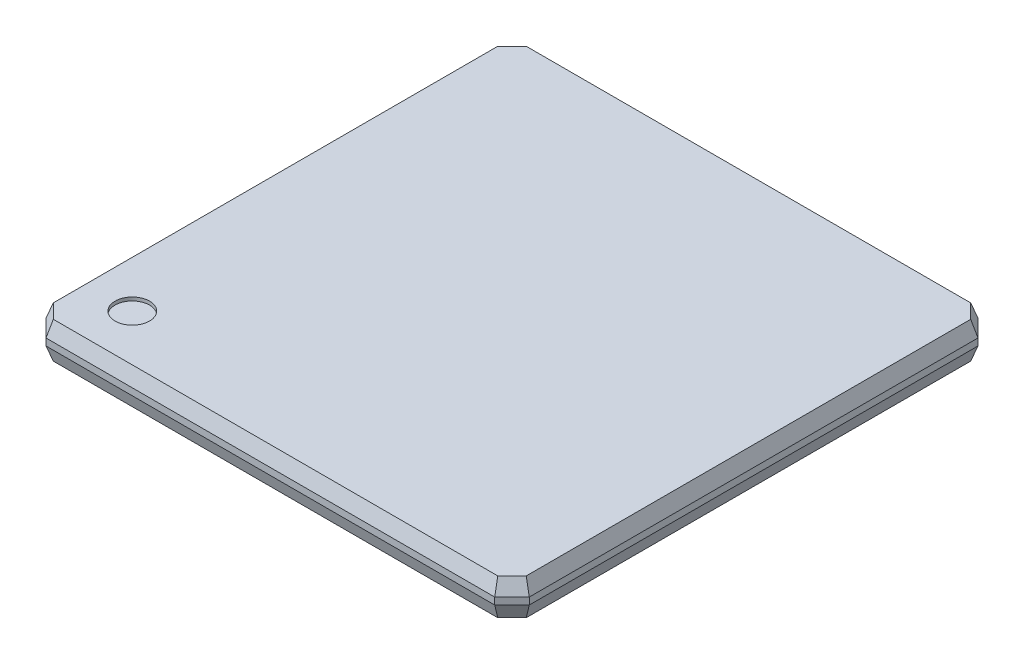
ISO-10303-21;
HEADER;
FILE_DESCRIPTION(('STEP AP214'),'2;1');
FILE_NAME('part.step','',(''),(''),'','','');
FILE_SCHEMA(('AUTOMOTIVE_DESIGN { 1 0 10303 214 1 1 1 1 }'));
ENDSEC;
DATA;
#1=APPLICATION_CONTEXT('core data for automotive mechanical design processes');
#2=APPLICATION_PROTOCOL_DEFINITION('international standard','automotive_design',2000,#1);
#3=PRODUCT_CONTEXT('',#1,'mechanical');
#4=PRODUCT('Part','Part','',(#3));
#5=PRODUCT_RELATED_PRODUCT_CATEGORY('part','',(#4));
#6=PRODUCT_DEFINITION_FORMATION('','',#4);
#7=PRODUCT_DEFINITION_CONTEXT('part definition',#1,'design');
#8=PRODUCT_DEFINITION('design','',#6,#7);
#9=PRODUCT_DEFINITION_SHAPE('','',#8);
#10=(LENGTH_UNIT() NAMED_UNIT(*) SI_UNIT(.MILLI.,.METRE.));
#11=(NAMED_UNIT(*) PLANE_ANGLE_UNIT() SI_UNIT($,.RADIAN.));
#12=(NAMED_UNIT(*) SI_UNIT($,.STERADIAN.) SOLID_ANGLE_UNIT());
#13=UNCERTAINTY_MEASURE_WITH_UNIT(LENGTH_MEASURE(1.E-05),#10,'distance_accuracy_value','');
#14=(GEOMETRIC_REPRESENTATION_CONTEXT(3) GLOBAL_UNCERTAINTY_ASSIGNED_CONTEXT((#13)) GLOBAL_UNIT_ASSIGNED_CONTEXT((#10,
#11,#12)) REPRESENTATION_CONTEXT('',''));
#15=CARTESIAN_POINT('',(0.,0.,0.));
#16=DIRECTION('',(0.,0.,1.));
#17=DIRECTION('',(1.,0.,0.));
#18=AXIS2_PLACEMENT_3D('',#15,#16,#17);
#19=CARTESIAN_POINT('',(-5.5,1.1,5.5));
#20=DIRECTION('',(0.,1.,0.));
#21=DIRECTION('',(0.,0.,1.));
#22=AXIS2_PLACEMENT_3D('',#19,#20,#21);
#23=PLANE('',#22);
#24=CARTESIAN_POINT('',(-5.5,1.1,5.5));
#25=DIRECTION('',(0.,-1.,0.));
#26=DIRECTION('',(0.,0.,-1.));
#27=AXIS2_PLACEMENT_3D('',#24,#25,#26);
#28=CIRCLE('',#27,0.5);
#29=CARTESIAN_POINT('',(-5.5,1.1,5.));
#30=VERTEX_POINT('',#29);
#31=EDGE_CURVE('E20',#30,#30,#28,.F.);
#32=ORIENTED_EDGE('',*,*,#31,.T.);
#33=EDGE_LOOP('',(#32));
#34=FACE_BOUND('',#33,.T.);
#35=ADVANCED_FACE('F17',(#34),#23,.T.);
#36=CARTESIAN_POINT('',(-5.5,1.2,5.5));
#37=DIRECTION('',(0.,-1.,0.));
#38=DIRECTION('',(0.,0.,-1.));
#39=AXIS2_PLACEMENT_3D('',#36,#37,#38);
#40=CYLINDRICAL_SURFACE('',#39,0.5);
#41=ORIENTED_EDGE('',*,*,#31,.F.);
#42=EDGE_LOOP('',(#41));
#43=FACE_BOUND('',#42,.T.);
#44=CARTESIAN_POINT('',(-5.5,1.2,5.5));
#45=DIRECTION('',(0.,-1.,0.));
#46=DIRECTION('',(0.,0.,-1.));
#47=AXIS2_PLACEMENT_3D('',#44,#45,#46);
#48=CIRCLE('',#47,0.5);
#49=CARTESIAN_POINT('',(-5.5,1.2,5.));
#50=VERTEX_POINT('',#49);
#51=EDGE_CURVE('E142',#50,#50,#48,.T.);
#52=ORIENTED_EDGE('',*,*,#51,.F.);
#53=EDGE_LOOP('',(#52));
#54=FACE_BOUND('',#53,.T.);
#55=ADVANCED_FACE('F165',(#43,#54),#40,.F.);
#56=CARTESIAN_POINT('',(0.,1.2,-7.));
#57=DIRECTION('',(0.,1.,0.));
#58=DIRECTION('',(0.,0.,1.));
#59=AXIS2_PLACEMENT_3D('',#56,#57,#58);
#60=PLANE('',#59);
#61=ORIENTED_EDGE('',*,*,#51,.T.);
#62=EDGE_LOOP('',(#61));
#63=FACE_BOUND('',#62,.T.);
#64=DIRECTION('',(-0.707106781186548,0.,0.707106781186548));
#65=VECTOR('',#64,1.);
#66=CARTESIAN_POINT('',(-4.89393398282204,1.20000000000002,-8.39393398282204));
#67=LINE('',#66,#65);
#68=CARTESIAN_POINT('',(-6.85000000000003,1.20000000000001,-6.43786796564401));
#69=VERTEX_POINT('',#68);
#70=CARTESIAN_POINT('',(-6.43786796564402,1.20000000000001,-6.85000000000003));
#71=VERTEX_POINT('',#70);
#72=EDGE_CURVE('E485',#69,#71,#67,.F.);
#73=ORIENTED_EDGE('',*,*,#72,.F.);
#74=DIRECTION('',(0.,0.,1.));
#75=VECTOR('',#74,1.);
#76=CARTESIAN_POINT('',(-6.85000000000004,1.20000000000001,-7.));
#77=LINE('',#76,#75);
#78=CARTESIAN_POINT('',(-6.85000000000003,1.20000000000001,6.43786796564402));
#79=VERTEX_POINT('',#78);
#80=EDGE_CURVE('E490',#79,#69,#77,.F.);
#81=ORIENTED_EDGE('',*,*,#80,.F.);
#82=DIRECTION('',(0.707106781186548,0.,0.707106781186548));
#83=VECTOR('',#82,1.);
#84=CARTESIAN_POINT('',(-8.39393398282204,1.20000000000002,4.89393398282204));
#85=LINE('',#84,#83);
#86=CARTESIAN_POINT('',(-6.43786796564401,1.20000000000001,6.85000000000003));
#87=VERTEX_POINT('',#86);
#88=EDGE_CURVE('E495',#87,#79,#85,.F.);
#89=ORIENTED_EDGE('',*,*,#88,.F.);
#90=DIRECTION('',(1.,0.,0.));
#91=VECTOR('',#90,1.);
#92=CARTESIAN_POINT('',(0.,1.20000000000001,6.85000000000004));
#93=LINE('',#92,#91);
#94=CARTESIAN_POINT('',(6.43786796564402,1.20000000000001,6.85000000000003));
#95=VERTEX_POINT('',#94);
#96=EDGE_CURVE('E449',#95,#87,#93,.F.);
#97=ORIENTED_EDGE('',*,*,#96,.F.);
#98=DIRECTION('',(0.707106781186548,0.,-0.707106781186548));
#99=VECTOR('',#98,1.);
#100=CARTESIAN_POINT('',(8.39393398282204,1.20000000000002,4.89393398282204));
#101=LINE('',#100,#99);
#102=CARTESIAN_POINT('',(6.85000000000003,1.20000000000001,6.43786796564401));
#103=VERTEX_POINT('',#102);
#104=EDGE_CURVE('E147',#103,#95,#101,.F.);
#105=ORIENTED_EDGE('',*,*,#104,.F.);
#106=DIRECTION('',(0.,0.,1.));
#107=VECTOR('',#106,1.);
#108=CARTESIAN_POINT('',(6.85000000000004,1.20000000000001,-7.));
#109=LINE('',#108,#107);
#110=CARTESIAN_POINT('',(6.85000000000003,1.20000000000001,-6.43786796564402));
#111=VERTEX_POINT('',#110);
#112=EDGE_CURVE('E128',#111,#103,#109,.T.);
#113=ORIENTED_EDGE('',*,*,#112,.F.);
#114=DIRECTION('',(-0.707106781186548,0.,-0.707106781186548));
#115=VECTOR('',#114,1.);
#116=CARTESIAN_POINT('',(4.89393398282204,1.20000000000002,-8.39393398282204));
#117=LINE('',#116,#115);
#118=CARTESIAN_POINT('',(6.43786796564402,1.20000000000001,-6.85000000000003));
#119=VERTEX_POINT('',#118);
#120=EDGE_CURVE('E133',#119,#111,#117,.F.);
#121=ORIENTED_EDGE('',*,*,#120,.F.);
#122=DIRECTION('',(1.,0.,0.));
#123=VECTOR('',#122,1.);
#124=CARTESIAN_POINT('',(0.,1.20000000000001,-6.85000000000004));
#125=LINE('',#124,#123);
#126=EDGE_CURVE('E479',#71,#119,#125,.T.);
#127=ORIENTED_EDGE('',*,*,#126,.F.);
#128=EDGE_LOOP('',(#73,#81,#89,#97,#105,#113,#121,#127));
#129=FACE_BOUND('',#128,.T.);
#130=ADVANCED_FACE('F145',(#63,#129),#60,.T.);
#131=CARTESIAN_POINT('',(4.946966991411,0.9875,-8.446966991411));
#132=DIRECTION('',(0.666794859469875,0.332820117734938,-0.666794859469875));
#133=DIRECTION('',(-0.707106781186548,0.,-0.707106781186548));
#134=AXIS2_PLACEMENT_3D('',#131,#132,#133);
#135=PLANE('',#134);
#136=DIRECTION('',(-0.329701872278663,0.934155304790039,0.136566987037767));
#137=VECTOR('',#136,1.);
#138=CARTESIAN_POINT('',(6.99999999999996,0.774999999999987,-6.5));
#139=LINE('',#138,#137);
#140=CARTESIAN_POINT('',(6.99999999999998,0.774999999999988,-6.49999999999998));
#141=VERTEX_POINT('',#140);
#142=EDGE_CURVE('E135',#141,#111,#139,.T.);
#143=ORIENTED_EDGE('',*,*,#142,.F.);
#144=DIRECTION('',(-0.707106781186548,0.,-0.707106781186548));
#145=VECTOR('',#144,1.);
#146=CARTESIAN_POINT('',(6.75,0.775,-6.75));
#147=LINE('',#146,#145);
#148=CARTESIAN_POINT('',(6.49999999999998,0.774999999999988,-6.99999999999998));
#149=VERTEX_POINT('',#148);
#150=EDGE_CURVE('E477',#149,#141,#147,.F.);
#151=ORIENTED_EDGE('',*,*,#150,.F.);
#152=DIRECTION('',(0.136566987037767,-0.934155304790039,-0.329701872278663));
#153=VECTOR('',#152,1.);
#154=CARTESIAN_POINT('',(6.437867965644,1.20000000000001,-6.85000000000004));
#155=LINE('',#154,#153);
#156=EDGE_CURVE('E138',#119,#149,#155,.T.);
#157=ORIENTED_EDGE('',*,*,#156,.F.);
#158=ORIENTED_EDGE('',*,*,#120,.T.);
#159=EDGE_LOOP('',(#143,#151,#157,#158));
#160=FACE_BOUND('',#159,.T.);
#161=ADVANCED_FACE('F134',(#160),#135,.T.);
#162=CARTESIAN_POINT('',(6.925,0.9875,-7.));
#163=DIRECTION('',(0.942990333582945,0.332820117734981,0.));
#164=DIRECTION('',(-0.332820117734981,0.942990333582945,0.));
#165=AXIS2_PLACEMENT_3D('',#162,#163,#164);
#166=PLANE('',#165);
#167=DIRECTION('',(-0.329701872278644,0.934155304790071,-0.136566987037592));
#168=VECTOR('',#167,1.);
#169=CARTESIAN_POINT('',(6.99999999999996,0.77499999999998,6.49999999999996));
#170=LINE('',#169,#168);
#171=CARTESIAN_POINT('',(6.99999999999997,0.774999999999989,6.49999999999999));
#172=VERTEX_POINT('',#171);
#173=EDGE_CURVE('E149',#172,#103,#170,.T.);
#174=ORIENTED_EDGE('',*,*,#173,.F.);
#175=DIRECTION('',(0.,0.,-1.));
#176=VECTOR('',#175,1.);
#177=CARTESIAN_POINT('',(7.,0.775,-7.));
#178=LINE('',#177,#176);
#179=EDGE_CURVE('E154',#141,#172,#178,.F.);
#180=ORIENTED_EDGE('',*,*,#179,.F.);
#181=ORIENTED_EDGE('',*,*,#142,.T.);
#182=ORIENTED_EDGE('',*,*,#112,.T.);
#183=EDGE_LOOP('',(#174,#180,#181,#182));
#184=FACE_BOUND('',#183,.T.);
#185=ADVANCED_FACE('F152',(#184),#166,.T.);
#186=CARTESIAN_POINT('',(8.446966991411,0.9875,4.946966991411));
#187=DIRECTION('',(0.666794859469875,0.332820117734938,0.666794859469875));
#188=DIRECTION('',(0.707106781186548,0.,-0.707106781186548));
#189=AXIS2_PLACEMENT_3D('',#186,#187,#188);
#190=PLANE('',#189);
#191=DIRECTION('',(-0.136566987037767,0.934155304790039,-0.329701872278663));
#192=VECTOR('',#191,1.);
#193=CARTESIAN_POINT('',(6.5,0.774999999999987,6.99999999999996));
#194=LINE('',#193,#192);
#195=CARTESIAN_POINT('',(6.49999999999998,0.774999999999988,6.99999999999998));
#196=VERTEX_POINT('',#195);
#197=EDGE_CURVE('E445',#196,#95,#194,.T.);
#198=ORIENTED_EDGE('',*,*,#197,.F.);
#199=DIRECTION('',(0.707106781186548,0.,-0.707106781186548));
#200=VECTOR('',#199,1.);
#201=CARTESIAN_POINT('',(6.75,0.775,6.75));
#202=LINE('',#201,#200);
#203=EDGE_CURVE('E447',#172,#196,#202,.F.);
#204=ORIENTED_EDGE('',*,*,#203,.F.);
#205=ORIENTED_EDGE('',*,*,#173,.T.);
#206=ORIENTED_EDGE('',*,*,#104,.T.);
#207=EDGE_LOOP('',(#198,#204,#205,#206));
#208=FACE_BOUND('',#207,.T.);
#209=ADVANCED_FACE('F264',(#208),#190,.T.);
#210=CARTESIAN_POINT('',(0.,0.9875,6.925));
#211=DIRECTION('',(0.,0.332820117734981,0.942990333582945));
#212=DIRECTION('',(0.,-0.942990333582945,0.332820117734981));
#213=AXIS2_PLACEMENT_3D('',#210,#211,#212);
#214=PLANE('',#213);
#215=ORIENTED_EDGE('',*,*,#197,.T.);
#216=ORIENTED_EDGE('',*,*,#96,.T.);
#217=DIRECTION('',(0.136566987037592,0.934155304790071,-0.329701872278644));
#218=VECTOR('',#217,1.);
#219=CARTESIAN_POINT('',(-6.49999999999996,0.77499999999998,6.99999999999996));
#220=LINE('',#219,#218);
#221=CARTESIAN_POINT('',(-6.49999999999999,0.774999999999989,6.99999999999997));
#222=VERTEX_POINT('',#221);
#223=EDGE_CURVE('E461',#222,#87,#220,.T.);
#224=ORIENTED_EDGE('',*,*,#223,.F.);
#225=DIRECTION('',(1.,0.,0.));
#226=VECTOR('',#225,1.);
#227=CARTESIAN_POINT('',(0.,0.775,7.));
#228=LINE('',#227,#226);
#229=EDGE_CURVE('E459',#196,#222,#228,.F.);
#230=ORIENTED_EDGE('',*,*,#229,.F.);
#231=EDGE_LOOP('',(#215,#216,#224,#230));
#232=FACE_BOUND('',#231,.T.);
#233=ADVANCED_FACE('F260',(#232),#214,.T.);
#234=CARTESIAN_POINT('',(-8.446966991411,0.9875,4.946966991411));
#235=DIRECTION('',(-0.666794859469875,0.332820117734938,0.666794859469875));
#236=DIRECTION('',(0.707106781186548,0.,0.707106781186548));
#237=AXIS2_PLACEMENT_3D('',#234,#235,#236);
#238=PLANE('',#237);
#239=DIRECTION('',(0.329701872278663,0.934155304790039,-0.136566987037767));
#240=VECTOR('',#239,1.);
#241=CARTESIAN_POINT('',(-6.99999999999996,0.774999999999987,6.5));
#242=LINE('',#241,#240);
#243=CARTESIAN_POINT('',(-6.99999999999998,0.774999999999988,6.49999999999998));
#244=VERTEX_POINT('',#243);
#245=EDGE_CURVE('E492',#244,#79,#242,.T.);
#246=ORIENTED_EDGE('',*,*,#245,.F.);
#247=DIRECTION('',(0.707106781186548,0.,0.707106781186548));
#248=VECTOR('',#247,1.);
#249=CARTESIAN_POINT('',(-6.75,0.775,6.75));
#250=LINE('',#249,#248);
#251=EDGE_CURVE('E464',#222,#244,#250,.F.);
#252=ORIENTED_EDGE('',*,*,#251,.F.);
#253=ORIENTED_EDGE('',*,*,#223,.T.);
#254=ORIENTED_EDGE('',*,*,#88,.T.);
#255=EDGE_LOOP('',(#246,#252,#253,#254));
#256=FACE_BOUND('',#255,.T.);
#257=ADVANCED_FACE('F256',(#256),#238,.T.);
#258=CARTESIAN_POINT('',(-6.925,0.9875,-7.));
#259=DIRECTION('',(-0.942990333582945,0.332820117734981,0.));
#260=DIRECTION('',(-0.332820117734981,-0.942990333582945,0.));
#261=AXIS2_PLACEMENT_3D('',#258,#259,#260);
#262=PLANE('',#261);
#263=ORIENTED_EDGE('',*,*,#245,.T.);
#264=ORIENTED_EDGE('',*,*,#80,.T.);
#265=DIRECTION('',(0.329701872278644,0.934155304790071,0.136566987037592));
#266=VECTOR('',#265,1.);
#267=CARTESIAN_POINT('',(-6.99999999999996,0.77499999999998,-6.49999999999996));
#268=LINE('',#267,#266);
#269=CARTESIAN_POINT('',(-6.99999999999997,0.774999999999989,-6.49999999999999));
#270=VERTEX_POINT('',#269);
#271=EDGE_CURVE('E487',#270,#69,#268,.T.);
#272=ORIENTED_EDGE('',*,*,#271,.F.);
#273=DIRECTION('',(0.,0.,1.));
#274=VECTOR('',#273,1.);
#275=CARTESIAN_POINT('',(-7.,0.775,-7.));
#276=LINE('',#275,#274);
#277=EDGE_CURVE('E509',#244,#270,#276,.F.);
#278=ORIENTED_EDGE('',*,*,#277,.F.);
#279=EDGE_LOOP('',(#263,#264,#272,#278));
#280=FACE_BOUND('',#279,.T.);
#281=ADVANCED_FACE('F252',(#280),#262,.T.);
#282=CARTESIAN_POINT('',(-4.946966991411,0.9875,-8.446966991411));
#283=DIRECTION('',(-0.666794859469875,0.332820117734938,-0.666794859469875));
#284=DIRECTION('',(-0.707106781186548,0.,0.707106781186548));
#285=AXIS2_PLACEMENT_3D('',#282,#283,#284);
#286=PLANE('',#285);
#287=DIRECTION('',(0.136566987037767,0.934155304790039,0.329701872278663));
#288=VECTOR('',#287,1.);
#289=CARTESIAN_POINT('',(-6.5,0.774999999999987,-6.99999999999996));
#290=LINE('',#289,#288);
#291=CARTESIAN_POINT('',(-6.49999999999998,0.774999999999988,-6.99999999999998));
#292=VERTEX_POINT('',#291);
#293=EDGE_CURVE('E481',#292,#71,#290,.T.);
#294=ORIENTED_EDGE('',*,*,#293,.F.);
#295=DIRECTION('',(-0.707106781186548,0.,0.707106781186548));
#296=VECTOR('',#295,1.);
#297=CARTESIAN_POINT('',(-6.75,0.775,-6.75));
#298=LINE('',#297,#296);
#299=EDGE_CURVE('E512',#270,#292,#298,.F.);
#300=ORIENTED_EDGE('',*,*,#299,.F.);
#301=ORIENTED_EDGE('',*,*,#271,.T.);
#302=ORIENTED_EDGE('',*,*,#72,.T.);
#303=EDGE_LOOP('',(#294,#300,#301,#302));
#304=FACE_BOUND('',#303,.T.);
#305=ADVANCED_FACE('F248',(#304),#286,.T.);
#306=CARTESIAN_POINT('',(0.,0.9875,-6.925));
#307=DIRECTION('',(0.,0.332820117734981,-0.942990333582945));
#308=DIRECTION('',(0.,0.942990333582945,0.332820117734981));
#309=AXIS2_PLACEMENT_3D('',#306,#307,#308);
#310=PLANE('',#309);
#311=ORIENTED_EDGE('',*,*,#293,.T.);
#312=ORIENTED_EDGE('',*,*,#126,.T.);
#313=ORIENTED_EDGE('',*,*,#156,.T.);
#314=DIRECTION('',(1.,0.,0.));
#315=VECTOR('',#314,1.);
#316=CARTESIAN_POINT('',(0.,0.775,-7.));
#317=LINE('',#316,#315);
#318=EDGE_CURVE('E523',#149,#292,#317,.F.);
#319=ORIENTED_EDGE('',*,*,#318,.T.);
#320=EDGE_LOOP('',(#311,#312,#313,#319));
#321=FACE_BOUND('',#320,.T.);
#322=ADVANCED_FACE('F244',(#321),#310,.T.);
#323=CARTESIAN_POINT('',(6.75,0.675,-6.75));
#324=DIRECTION('',(0.707106781186548,0.,-0.707106781186548));
#325=DIRECTION('',(-0.707106781186548,0.,-0.707106781186548));
#326=AXIS2_PLACEMENT_3D('',#323,#324,#325);
#327=PLANE('',#326);
#328=DIRECTION('',(-0.707106781186548,0.,-0.707106781186548));
#329=VECTOR('',#328,1.);
#330=CARTESIAN_POINT('',(4.99999999999996,0.57500000000002,-8.49999999999996));
#331=LINE('',#330,#329);
#332=CARTESIAN_POINT('',(6.49999999999999,0.575000000000007,-6.99999999999999));
#333=VERTEX_POINT('',#332);
#334=CARTESIAN_POINT('',(6.99999999999999,0.575000000000007,-6.49999999999999));
#335=VERTEX_POINT('',#334);
#336=EDGE_CURVE('E526',#333,#335,#331,.F.);
#337=ORIENTED_EDGE('',*,*,#336,.F.);
#338=DIRECTION('',(0.,-1.,0.));
#339=VECTOR('',#338,1.);
#340=CARTESIAN_POINT('',(6.5,0.675,-7.));
#341=LINE('',#340,#339);
#342=EDGE_CURVE('E520',#333,#149,#341,.F.);
#343=ORIENTED_EDGE('',*,*,#342,.T.);
#344=ORIENTED_EDGE('',*,*,#150,.T.);
#345=DIRECTION('',(0.,1.,0.));
#346=VECTOR('',#345,1.);
#347=CARTESIAN_POINT('',(7.,0.675,-6.5));
#348=LINE('',#347,#346);
#349=EDGE_CURVE('E475',#335,#141,#348,.T.);
#350=ORIENTED_EDGE('',*,*,#349,.F.);
#351=EDGE_LOOP('',(#337,#343,#344,#350));
#352=FACE_BOUND('',#351,.T.);
#353=ADVANCED_FACE('F240',(#352),#327,.T.);
#354=CARTESIAN_POINT('',(7.,0.675,-7.));
#355=DIRECTION('',(1.,0.,0.));
#356=DIRECTION('',(0.,0.,-1.));
#357=AXIS2_PLACEMENT_3D('',#354,#355,#356);
#358=PLANE('',#357);
#359=DIRECTION('',(0.,1.,0.));
#360=VECTOR('',#359,1.);
#361=CARTESIAN_POINT('',(7.,0.675,6.5));
#362=LINE('',#361,#360);
#363=CARTESIAN_POINT('',(6.99999999999999,0.575000000000006,6.5));
#364=VERTEX_POINT('',#363);
#365=EDGE_CURVE('E456',#364,#172,#362,.T.);
#366=ORIENTED_EDGE('',*,*,#365,.F.);
#367=DIRECTION('',(0.,0.,1.));
#368=VECTOR('',#367,1.);
#369=CARTESIAN_POINT('',(6.99999999999996,0.575000000000013,-7.));
#370=LINE('',#369,#368);
#371=EDGE_CURVE('E532',#335,#364,#370,.T.);
#372=ORIENTED_EDGE('',*,*,#371,.F.);
#373=ORIENTED_EDGE('',*,*,#349,.T.);
#374=ORIENTED_EDGE('',*,*,#179,.T.);
#375=EDGE_LOOP('',(#366,#372,#373,#374));
#376=FACE_BOUND('',#375,.T.);
#377=ADVANCED_FACE('F236',(#376),#358,.T.);
#378=CARTESIAN_POINT('',(6.75,0.675,6.75));
#379=DIRECTION('',(0.707106781186548,0.,0.707106781186548));
#380=DIRECTION('',(0.707106781186548,0.,-0.707106781186548));
#381=AXIS2_PLACEMENT_3D('',#378,#379,#380);
#382=PLANE('',#381);
#383=DIRECTION('',(0.707106781186548,0.,-0.707106781186548));
#384=VECTOR('',#383,1.);
#385=CARTESIAN_POINT('',(8.49999999999996,0.57500000000002,4.99999999999996));
#386=LINE('',#385,#384);
#387=CARTESIAN_POINT('',(6.49999999999999,0.575000000000007,6.99999999999999));
#388=VERTEX_POINT('',#387);
#389=EDGE_CURVE('E538',#364,#388,#386,.F.);
#390=ORIENTED_EDGE('',*,*,#389,.F.);
#391=ORIENTED_EDGE('',*,*,#365,.T.);
#392=ORIENTED_EDGE('',*,*,#203,.T.);
#393=DIRECTION('',(0.,-1.,0.));
#394=VECTOR('',#393,1.);
#395=CARTESIAN_POINT('',(6.5,0.675,7.));
#396=LINE('',#395,#394);
#397=EDGE_CURVE('E454',#388,#196,#396,.F.);
#398=ORIENTED_EDGE('',*,*,#397,.F.);
#399=EDGE_LOOP('',(#390,#391,#392,#398));
#400=FACE_BOUND('',#399,.T.);
#401=ADVANCED_FACE('F232',(#400),#382,.T.);
#402=CARTESIAN_POINT('',(0.,0.675,7.));
#403=DIRECTION('',(0.,0.,1.));
#404=DIRECTION('',(0.,-1.,0.));
#405=AXIS2_PLACEMENT_3D('',#402,#403,#404);
#406=PLANE('',#405);
#407=ORIENTED_EDGE('',*,*,#397,.T.);
#408=ORIENTED_EDGE('',*,*,#229,.T.);
#409=DIRECTION('',(0.,1.,0.));
#410=VECTOR('',#409,1.);
#411=CARTESIAN_POINT('',(-6.5,0.675,7.));
#412=LINE('',#411,#410);
#413=CARTESIAN_POINT('',(-6.5,0.575000000000006,6.99999999999999));
#414=VERTEX_POINT('',#413);
#415=EDGE_CURVE('E503',#414,#222,#412,.T.);
#416=ORIENTED_EDGE('',*,*,#415,.F.);
#417=DIRECTION('',(1.,0.,0.));
#418=VECTOR('',#417,1.);
#419=CARTESIAN_POINT('',(0.,0.575000000000013,6.99999999999996));
#420=LINE('',#419,#418);
#421=EDGE_CURVE('E468',#388,#414,#420,.F.);
#422=ORIENTED_EDGE('',*,*,#421,.F.);
#423=EDGE_LOOP('',(#407,#408,#416,#422));
#424=FACE_BOUND('',#423,.T.);
#425=ADVANCED_FACE('F228',(#424),#406,.T.);
#426=CARTESIAN_POINT('',(-6.75,0.675,6.75));
#427=DIRECTION('',(-0.707106781186548,0.,0.707106781186548));
#428=DIRECTION('',(0.707106781186548,0.,0.707106781186548));
#429=AXIS2_PLACEMENT_3D('',#426,#427,#428);
#430=PLANE('',#429);
#431=DIRECTION('',(0.707106781186548,0.,0.707106781186548));
#432=VECTOR('',#431,1.);
#433=CARTESIAN_POINT('',(-8.49999999999996,0.57500000000002,4.99999999999996));
#434=LINE('',#433,#432);
#435=CARTESIAN_POINT('',(-6.99999999999999,0.575000000000007,6.49999999999999));
#436=VERTEX_POINT('',#435);
#437=EDGE_CURVE('E546',#414,#436,#434,.F.);
#438=ORIENTED_EDGE('',*,*,#437,.F.);
#439=ORIENTED_EDGE('',*,*,#415,.T.);
#440=ORIENTED_EDGE('',*,*,#251,.T.);
#441=DIRECTION('',(0.,1.,0.));
#442=VECTOR('',#441,1.);
#443=CARTESIAN_POINT('',(-7.,0.675,6.5));
#444=LINE('',#443,#442);
#445=EDGE_CURVE('E504',#436,#244,#444,.T.);
#446=ORIENTED_EDGE('',*,*,#445,.F.);
#447=EDGE_LOOP('',(#438,#439,#440,#446));
#448=FACE_BOUND('',#447,.T.);
#449=ADVANCED_FACE('F224',(#448),#430,.T.);
#450=CARTESIAN_POINT('',(-7.,0.675,-7.));
#451=DIRECTION('',(-1.,0.,0.));
#452=DIRECTION('',(0.,0.,1.));
#453=AXIS2_PLACEMENT_3D('',#450,#451,#452);
#454=PLANE('',#453);
#455=ORIENTED_EDGE('',*,*,#445,.T.);
#456=ORIENTED_EDGE('',*,*,#277,.T.);
#457=DIRECTION('',(0.,1.,0.));
#458=VECTOR('',#457,1.);
#459=CARTESIAN_POINT('',(-7.,0.675,-6.5));
#460=LINE('',#459,#458);
#461=CARTESIAN_POINT('',(-6.99999999999999,0.575000000000006,-6.5));
#462=VERTEX_POINT('',#461);
#463=EDGE_CURVE('E515',#462,#270,#460,.T.);
#464=ORIENTED_EDGE('',*,*,#463,.F.);
#465=DIRECTION('',(0.,0.,1.));
#466=VECTOR('',#465,1.);
#467=CARTESIAN_POINT('',(-6.99999999999996,0.575000000000013,-7.));
#468=LINE('',#467,#466);
#469=EDGE_CURVE('E552',#436,#462,#468,.F.);
#470=ORIENTED_EDGE('',*,*,#469,.F.);
#471=EDGE_LOOP('',(#455,#456,#464,#470));
#472=FACE_BOUND('',#471,.T.);
#473=ADVANCED_FACE('F220',(#472),#454,.T.);
#474=CARTESIAN_POINT('',(-6.75,0.675,-6.75));
#475=DIRECTION('',(-0.707106781186548,0.,-0.707106781186548));
#476=DIRECTION('',(-0.707106781186548,0.,0.707106781186548));
#477=AXIS2_PLACEMENT_3D('',#474,#475,#476);
#478=PLANE('',#477);
#479=DIRECTION('',(-0.707106781186548,0.,0.707106781186548));
#480=VECTOR('',#479,1.);
#481=CARTESIAN_POINT('',(-4.99999999999996,0.57500000000002,-8.49999999999996));
#482=LINE('',#481,#480);
#483=CARTESIAN_POINT('',(-6.49999999999999,0.575000000000007,-6.99999999999999));
#484=VERTEX_POINT('',#483);
#485=EDGE_CURVE('E558',#462,#484,#482,.F.);
#486=ORIENTED_EDGE('',*,*,#485,.F.);
#487=ORIENTED_EDGE('',*,*,#463,.T.);
#488=ORIENTED_EDGE('',*,*,#299,.T.);
#489=DIRECTION('',(0.,-1.,0.));
#490=VECTOR('',#489,1.);
#491=CARTESIAN_POINT('',(-6.5,0.675,-7.));
#492=LINE('',#491,#490);
#493=EDGE_CURVE('E518',#292,#484,#492,.T.);
#494=ORIENTED_EDGE('',*,*,#493,.T.);
#495=EDGE_LOOP('',(#486,#487,#488,#494));
#496=FACE_BOUND('',#495,.T.);
#497=ADVANCED_FACE('F216',(#496),#478,.T.);
#498=CARTESIAN_POINT('',(0.,0.675,-7.));
#499=DIRECTION('',(0.,0.,1.));
#500=DIRECTION('',(0.,-1.,0.));
#501=AXIS2_PLACEMENT_3D('',#498,#499,#500);
#502=PLANE('',#501);
#503=ORIENTED_EDGE('',*,*,#342,.F.);
#504=DIRECTION('',(1.,0.,0.));
#505=VECTOR('',#504,1.);
#506=CARTESIAN_POINT('',(0.,0.575000000000013,-6.99999999999996));
#507=LINE('',#506,#505);
#508=EDGE_CURVE('E564',#484,#333,#507,.T.);
#509=ORIENTED_EDGE('',*,*,#508,.F.);
#510=ORIENTED_EDGE('',*,*,#493,.F.);
#511=ORIENTED_EDGE('',*,*,#318,.F.);
#512=EDGE_LOOP('',(#503,#509,#510,#511));
#513=FACE_BOUND('',#512,.T.);
#514=ADVANCED_FACE('F212',(#513),#502,.F.);
#515=CARTESIAN_POINT('',(4.946966991411,0.3625,-8.446966991411));
#516=DIRECTION('',(0.666794859469875,-0.332820117734938,-0.666794859469875));
#517=DIRECTION('',(-0.707106781186548,0.,-0.707106781186548));
#518=AXIS2_PLACEMENT_3D('',#515,#516,#517);
#519=PLANE('',#518);
#520=DIRECTION('',(-0.136566987037767,-0.934155304790039,0.329701872278663));
#521=VECTOR('',#520,1.);
#522=CARTESIAN_POINT('',(6.5,0.575000000000013,-6.99999999999996));
#523=LINE('',#522,#521);
#524=CARTESIAN_POINT('',(6.43786796564402,0.149999999999988,-6.85000000000003));
#525=VERTEX_POINT('',#524);
#526=EDGE_CURVE('E560',#333,#525,#523,.T.);
#527=ORIENTED_EDGE('',*,*,#526,.F.);
#528=ORIENTED_EDGE('',*,*,#336,.T.);
#529=DIRECTION('',(0.329701872278663,0.934155304790039,-0.136566987037767));
#530=VECTOR('',#529,1.);
#531=CARTESIAN_POINT('',(6.85000000000004,0.149999999999988,-6.437867965644));
#532=LINE('',#531,#530);
#533=CARTESIAN_POINT('',(6.85000000000003,0.149999999999988,-6.43786796564402));
#534=VERTEX_POINT('',#533);
#535=EDGE_CURVE('E529',#534,#335,#532,.T.);
#536=ORIENTED_EDGE('',*,*,#535,.F.);
#537=DIRECTION('',(0.707106781186548,0.,0.707106781186548));
#538=VECTOR('',#537,1.);
#539=CARTESIAN_POINT('',(6.437867965644,0.150000000000001,-6.85));
#540=LINE('',#539,#538);
#541=EDGE_CURVE('E567',#525,#534,#540,.T.);
#542=ORIENTED_EDGE('',*,*,#541,.F.);
#543=EDGE_LOOP('',(#527,#528,#536,#542));
#544=FACE_BOUND('',#543,.T.);
#545=ADVANCED_FACE('F208',(#544),#519,.T.);
#546=CARTESIAN_POINT('',(6.925,0.3625,-7.));
#547=DIRECTION('',(0.942990333582945,-0.332820117734981,0.));
#548=DIRECTION('',(0.332820117734981,0.942990333582945,0.));
#549=AXIS2_PLACEMENT_3D('',#546,#547,#548);
#550=PLANE('',#549);
#551=DIRECTION('',(0.329701872278644,0.934155304790071,0.136566987037592));
#552=VECTOR('',#551,1.);
#553=CARTESIAN_POINT('',(6.85000000000004,0.149999999999981,6.43786796564404));
#554=LINE('',#553,#552);
#555=CARTESIAN_POINT('',(6.85000000000003,0.149999999999989,6.43786796564401));
#556=VERTEX_POINT('',#555);
#557=EDGE_CURVE('E535',#556,#364,#554,.T.);
#558=ORIENTED_EDGE('',*,*,#557,.F.);
#559=DIRECTION('',(0.,0.,1.));
#560=VECTOR('',#559,1.);
#561=CARTESIAN_POINT('',(6.85,0.150000000000001,-7.));
#562=LINE('',#561,#560);
#563=EDGE_CURVE('E570',#534,#556,#562,.T.);
#564=ORIENTED_EDGE('',*,*,#563,.F.);
#565=ORIENTED_EDGE('',*,*,#535,.T.);
#566=ORIENTED_EDGE('',*,*,#371,.T.);
#567=EDGE_LOOP('',(#558,#564,#565,#566));
#568=FACE_BOUND('',#567,.T.);
#569=ADVANCED_FACE('F204',(#568),#550,.T.);
#570=CARTESIAN_POINT('',(8.446966991411,0.3625,4.946966991411));
#571=DIRECTION('',(0.666794859469875,-0.332820117734938,0.666794859469875));
#572=DIRECTION('',(0.707106781186548,0.,-0.707106781186548));
#573=AXIS2_PLACEMENT_3D('',#570,#571,#572);
#574=PLANE('',#573);
#575=ORIENTED_EDGE('',*,*,#557,.T.);
#576=ORIENTED_EDGE('',*,*,#389,.T.);
#577=DIRECTION('',(0.136566987037767,0.934155304790039,0.329701872278663));
#578=VECTOR('',#577,1.);
#579=CARTESIAN_POINT('',(6.437867965644,0.149999999999988,6.85000000000004));
#580=LINE('',#579,#578);
#581=CARTESIAN_POINT('',(6.43786796564402,0.149999999999988,6.85000000000003));
#582=VERTEX_POINT('',#581);
#583=EDGE_CURVE('E540',#582,#388,#580,.T.);
#584=ORIENTED_EDGE('',*,*,#583,.F.);
#585=DIRECTION('',(-0.707106781186548,0.,0.707106781186548));
#586=VECTOR('',#585,1.);
#587=CARTESIAN_POINT('',(6.85,0.150000000000001,6.437867965644));
#588=LINE('',#587,#586);
#589=EDGE_CURVE('E573',#556,#582,#588,.T.);
#590=ORIENTED_EDGE('',*,*,#589,.F.);
#591=EDGE_LOOP('',(#575,#576,#584,#590));
#592=FACE_BOUND('',#591,.T.);
#593=ADVANCED_FACE('F200',(#592),#574,.T.);
#594=CARTESIAN_POINT('',(0.,0.3625,6.925));
#595=DIRECTION('',(0.,-0.332820117734981,0.942990333582945));
#596=DIRECTION('',(0.,-0.942990333582945,-0.332820117734981));
#597=AXIS2_PLACEMENT_3D('',#594,#595,#596);
#598=PLANE('',#597);
#599=ORIENTED_EDGE('',*,*,#583,.T.);
#600=ORIENTED_EDGE('',*,*,#421,.T.);
#601=DIRECTION('',(-0.136566987037592,0.934155304790071,0.329701872278644));
#602=VECTOR('',#601,1.);
#603=CARTESIAN_POINT('',(-6.43786796564404,0.149999999999981,6.85000000000004));
#604=LINE('',#603,#602);
#605=CARTESIAN_POINT('',(-6.43786796564401,0.149999999999989,6.85000000000003));
#606=VERTEX_POINT('',#605);
#607=EDGE_CURVE('E543',#606,#414,#604,.T.);
#608=ORIENTED_EDGE('',*,*,#607,.F.);
#609=DIRECTION('',(1.,0.,0.));
#610=VECTOR('',#609,1.);
#611=CARTESIAN_POINT('',(0.,0.15,6.85));
#612=LINE('',#611,#610);
#613=EDGE_CURVE('E576',#582,#606,#612,.F.);
#614=ORIENTED_EDGE('',*,*,#613,.F.);
#615=EDGE_LOOP('',(#599,#600,#608,#614));
#616=FACE_BOUND('',#615,.T.);
#617=ADVANCED_FACE('F196',(#616),#598,.T.);
#618=CARTESIAN_POINT('',(-8.446966991411,0.3625,4.946966991411));
#619=DIRECTION('',(-0.666794859469875,-0.332820117734938,0.666794859469875));
#620=DIRECTION('',(0.707106781186548,0.,0.707106781186548));
#621=AXIS2_PLACEMENT_3D('',#618,#619,#620);
#622=PLANE('',#621);
#623=ORIENTED_EDGE('',*,*,#607,.T.);
#624=ORIENTED_EDGE('',*,*,#437,.T.);
#625=DIRECTION('',(-0.329701872278663,0.934155304790039,0.136566987037767));
#626=VECTOR('',#625,1.);
#627=CARTESIAN_POINT('',(-6.85000000000004,0.149999999999988,6.437867965644));
#628=LINE('',#627,#626);
#629=CARTESIAN_POINT('',(-6.85000000000003,0.149999999999987,6.43786796564402));
#630=VERTEX_POINT('',#629);
#631=EDGE_CURVE('E549',#630,#436,#628,.T.);
#632=ORIENTED_EDGE('',*,*,#631,.F.);
#633=DIRECTION('',(-0.707106781186548,0.,-0.707106781186548));
#634=VECTOR('',#633,1.);
#635=CARTESIAN_POINT('',(-6.437867965644,0.149999999999999,6.85));
#636=LINE('',#635,#634);
#637=EDGE_CURVE('E579',#606,#630,#636,.T.);
#638=ORIENTED_EDGE('',*,*,#637,.F.);
#639=EDGE_LOOP('',(#623,#624,#632,#638));
#640=FACE_BOUND('',#639,.T.);
#641=ADVANCED_FACE('F192',(#640),#622,.T.);
#642=CARTESIAN_POINT('',(-6.925,0.3625,-7.));
#643=DIRECTION('',(-0.942990333582945,-0.332820117734981,0.));
#644=DIRECTION('',(0.332820117734981,-0.942990333582945,0.));
#645=AXIS2_PLACEMENT_3D('',#642,#643,#644);
#646=PLANE('',#645);
#647=ORIENTED_EDGE('',*,*,#631,.T.);
#648=ORIENTED_EDGE('',*,*,#469,.T.);
#649=DIRECTION('',(-0.329701872278644,0.934155304790071,-0.136566987037592));
#650=VECTOR('',#649,1.);
#651=CARTESIAN_POINT('',(-6.85000000000004,0.149999999999981,-6.43786796564404));
#652=LINE('',#651,#650);
#653=CARTESIAN_POINT('',(-6.85000000000003,0.149999999999989,-6.43786796564401));
#654=VERTEX_POINT('',#653);
#655=EDGE_CURVE('E555',#654,#462,#652,.T.);
#656=ORIENTED_EDGE('',*,*,#655,.F.);
#657=DIRECTION('',(0.,0.,1.));
#658=VECTOR('',#657,1.);
#659=CARTESIAN_POINT('',(-6.85,0.149999999999999,-7.));
#660=LINE('',#659,#658);
#661=EDGE_CURVE('E582',#630,#654,#660,.F.);
#662=ORIENTED_EDGE('',*,*,#661,.F.);
#663=EDGE_LOOP('',(#647,#648,#656,#662));
#664=FACE_BOUND('',#663,.T.);
#665=ADVANCED_FACE('F189',(#664),#646,.T.);
#666=CARTESIAN_POINT('',(-4.946966991411,0.3625,-8.446966991411));
#667=DIRECTION('',(-0.666794859469875,-0.332820117734938,-0.666794859469875));
#668=DIRECTION('',(-0.707106781186548,0.,0.707106781186548));
#669=AXIS2_PLACEMENT_3D('',#666,#667,#668);
#670=PLANE('',#669);
#671=ORIENTED_EDGE('',*,*,#655,.T.);
#672=ORIENTED_EDGE('',*,*,#485,.T.);
#673=DIRECTION('',(-0.136566987037767,0.934155304790039,-0.329701872278663));
#674=VECTOR('',#673,1.);
#675=CARTESIAN_POINT('',(-6.437867965644,0.149999999999988,-6.85000000000004));
#676=LINE('',#675,#674);
#677=CARTESIAN_POINT('',(-6.43786796564402,0.149999999999987,-6.85000000000003));
#678=VERTEX_POINT('',#677);
#679=EDGE_CURVE('E35',#678,#484,#676,.T.);
#680=ORIENTED_EDGE('',*,*,#679,.F.);
#681=DIRECTION('',(0.707106781186548,0.,-0.707106781186548));
#682=VECTOR('',#681,1.);
#683=CARTESIAN_POINT('',(-6.85,0.149999999999999,-6.437867965644));
#684=LINE('',#683,#682);
#685=EDGE_CURVE('E26',#654,#678,#684,.T.);
#686=ORIENTED_EDGE('',*,*,#685,.F.);
#687=EDGE_LOOP('',(#671,#672,#680,#686));
#688=FACE_BOUND('',#687,.T.);
#689=ADVANCED_FACE('F182',(#688),#670,.T.);
#690=CARTESIAN_POINT('',(0.,0.3625,-6.925));
#691=DIRECTION('',(0.,-0.332820117734981,-0.942990333582945));
#692=DIRECTION('',(0.,0.942990333582945,-0.332820117734981));
#693=AXIS2_PLACEMENT_3D('',#690,#691,#692);
#694=PLANE('',#693);
#695=ORIENTED_EDGE('',*,*,#679,.T.);
#696=ORIENTED_EDGE('',*,*,#508,.T.);
#697=ORIENTED_EDGE('',*,*,#526,.T.);
#698=DIRECTION('',(1.,0.,0.));
#699=VECTOR('',#698,1.);
#700=CARTESIAN_POINT('',(0.,0.15,-6.85));
#701=LINE('',#700,#699);
#702=EDGE_CURVE('E11',#678,#525,#701,.T.);
#703=ORIENTED_EDGE('',*,*,#702,.F.);
#704=EDGE_LOOP('',(#695,#696,#697,#703));
#705=FACE_BOUND('',#704,.T.);
#706=ADVANCED_FACE('F176',(#705),#694,.T.);
#707=CARTESIAN_POINT('',(0.,0.15,-7.));
#708=DIRECTION('',(0.,-1.,0.));
#709=DIRECTION('',(1.,0.,0.));
#710=AXIS2_PLACEMENT_3D('',#707,#708,#709);
#711=PLANE('',#710);
#712=ORIENTED_EDGE('',*,*,#685,.T.);
#713=ORIENTED_EDGE('',*,*,#702,.T.);
#714=ORIENTED_EDGE('',*,*,#541,.T.);
#715=ORIENTED_EDGE('',*,*,#563,.T.);
#716=ORIENTED_EDGE('',*,*,#589,.T.);
#717=ORIENTED_EDGE('',*,*,#613,.T.);
#718=ORIENTED_EDGE('',*,*,#637,.T.);
#719=ORIENTED_EDGE('',*,*,#661,.T.);
#720=EDGE_LOOP('',(#712,#713,#714,#715,#716,#717,#718,#719));
#721=FACE_BOUND('',#720,.T.);
#722=ADVANCED_FACE('F174',(#721),#711,.T.);
#723=CLOSED_SHELL('',(#35,#55,#130,#161,#185,#209,#233,#257,#281,#305,#322,#353,#377,#401,#425,
#449,#473,#497,#514,#545,#569,#593,#617,#641,#665,#689,#706,#722));
#724=MANIFOLD_SOLID_BREP('B1',#723);
#725=ADVANCED_BREP_SHAPE_REPRESENTATION('',(#18,#724),#14);
#726=SHAPE_DEFINITION_REPRESENTATION(#9,#725);
ENDSEC;
END-ISO-10303-21;
